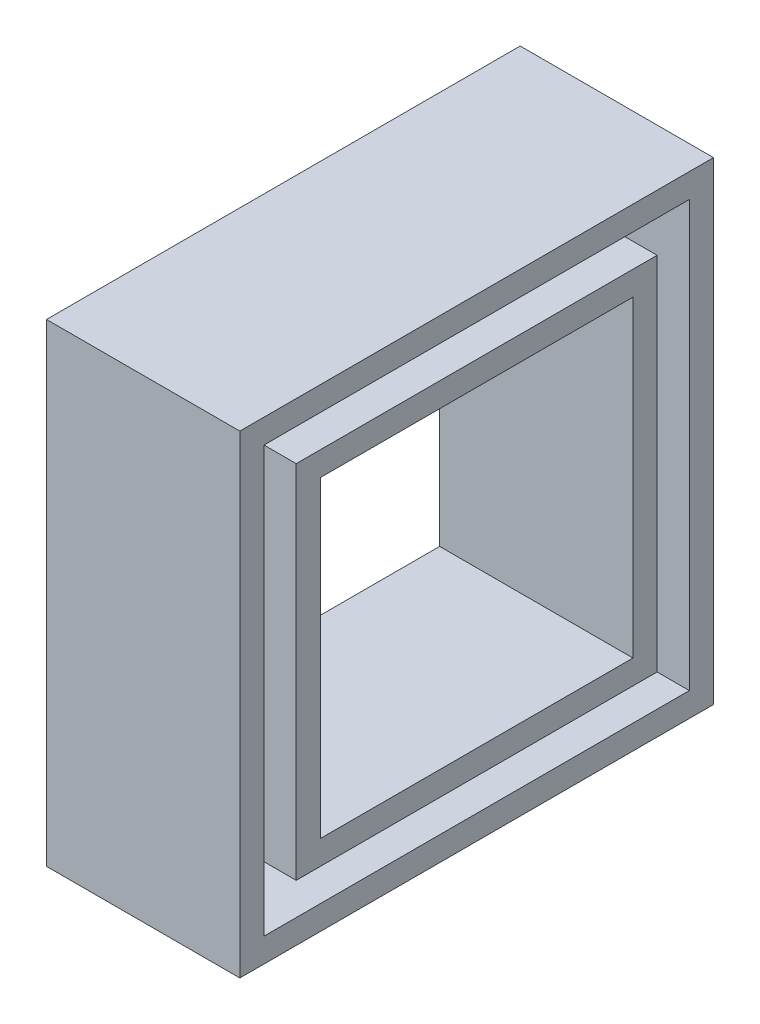
ISO-10303-21;
HEADER;
FILE_DESCRIPTION(('STEP AP214'),'2;1');
FILE_NAME('part.step','',(''),(''),'','','');
FILE_SCHEMA(('AUTOMOTIVE_DESIGN { 1 0 10303 214 1 1 1 1 }'));
ENDSEC;
DATA;
#1=APPLICATION_CONTEXT('core data for automotive mechanical design processes');
#2=APPLICATION_PROTOCOL_DEFINITION('international standard','automotive_design',2000,#1);
#3=PRODUCT_CONTEXT('',#1,'mechanical');
#4=PRODUCT('Part','Part','',(#3));
#5=PRODUCT_RELATED_PRODUCT_CATEGORY('part','',(#4));
#6=PRODUCT_DEFINITION_FORMATION('','',#4);
#7=PRODUCT_DEFINITION_CONTEXT('part definition',#1,'design');
#8=PRODUCT_DEFINITION('design','',#6,#7);
#9=PRODUCT_DEFINITION_SHAPE('','',#8);
#10=(LENGTH_UNIT() NAMED_UNIT(*) SI_UNIT(.MILLI.,.METRE.));
#11=(NAMED_UNIT(*) PLANE_ANGLE_UNIT() SI_UNIT($,.RADIAN.));
#12=(NAMED_UNIT(*) SI_UNIT($,.STERADIAN.) SOLID_ANGLE_UNIT());
#13=UNCERTAINTY_MEASURE_WITH_UNIT(LENGTH_MEASURE(1.E-05),#10,'distance_accuracy_value','');
#14=(GEOMETRIC_REPRESENTATION_CONTEXT(3) GLOBAL_UNCERTAINTY_ASSIGNED_CONTEXT((#13)) GLOBAL_UNIT_ASSIGNED_CONTEXT((#10,
#11,#12)) REPRESENTATION_CONTEXT('',''));
#15=CARTESIAN_POINT('',(0.,0.,0.));
#16=DIRECTION('',(0.,0.,1.));
#17=DIRECTION('',(1.,0.,0.));
#18=AXIS2_PLACEMENT_3D('',#15,#16,#17);
#19=CARTESIAN_POINT('',(10.,0.,0.));
#20=DIRECTION('',(1.,0.,0.));
#21=DIRECTION('',(0.,0.,-1.));
#22=AXIS2_PLACEMENT_3D('',#19,#20,#21);
#23=PLANE('',#22);
#24=DIRECTION('',(0.,0.,1.));
#25=VECTOR('',#24,1.);
#26=CARTESIAN_POINT('',(10.,-3.,0.));
#27=LINE('',#26,#25);
#28=CARTESIAN_POINT('',(10.,-3.,3.));
#29=VERTEX_POINT('',#28);
#30=CARTESIAN_POINT('',(10.,-3.,22.4));
#31=VERTEX_POINT('',#30);
#32=EDGE_CURVE('E309',#29,#31,#27,.T.);
#33=ORIENTED_EDGE('',*,*,#32,.F.);
#34=DIRECTION('',(0.,-1.,0.));
#35=VECTOR('',#34,1.);
#36=CARTESIAN_POINT('',(10.,0.,3.));
#37=LINE('',#36,#35);
#38=CARTESIAN_POINT('',(10.,-22.4,3.));
#39=VERTEX_POINT('',#38);
#40=EDGE_CURVE('E313',#29,#39,#37,.T.);
#41=ORIENTED_EDGE('',*,*,#40,.T.);
#42=DIRECTION('',(0.,0.,1.));
#43=VECTOR('',#42,1.);
#44=CARTESIAN_POINT('',(10.,-22.4,0.));
#45=LINE('',#44,#43);
#46=CARTESIAN_POINT('',(10.,-22.4,22.4));
#47=VERTEX_POINT('',#46);
#48=EDGE_CURVE('E317',#39,#47,#45,.T.);
#49=ORIENTED_EDGE('',*,*,#48,.T.);
#50=DIRECTION('',(0.,-1.,0.));
#51=VECTOR('',#50,1.);
#52=CARTESIAN_POINT('',(10.,0.,22.4));
#53=LINE('',#52,#51);
#54=EDGE_CURVE('E320',#31,#47,#53,.T.);
#55=ORIENTED_EDGE('',*,*,#54,.F.);
#56=EDGE_LOOP('',(#33,#41,#49,#55));
#57=FACE_BOUND('',#56,.T.);
#58=DIRECTION('',(0.,1.,0.));
#59=VECTOR('',#58,1.);
#60=CARTESIAN_POINT('',(10.,-1.5,1.5));
#61=LINE('',#60,#59);
#62=CARTESIAN_POINT('',(10.,-23.9,1.5));
#63=VERTEX_POINT('',#62);
#64=CARTESIAN_POINT('',(10.,-1.5,1.5));
#65=VERTEX_POINT('',#64);
#66=EDGE_CURVE('E245',#63,#65,#61,.T.);
#67=ORIENTED_EDGE('',*,*,#66,.T.);
#68=DIRECTION('',(0.,0.,1.));
#69=VECTOR('',#68,1.);
#70=CARTESIAN_POINT('',(10.,-1.5,23.9));
#71=LINE('',#70,#69);
#72=CARTESIAN_POINT('',(10.,-1.5,23.9));
#73=VERTEX_POINT('',#72);
#74=EDGE_CURVE('E210',#65,#73,#71,.T.);
#75=ORIENTED_EDGE('',*,*,#74,.T.);
#76=DIRECTION('',(0.,-1.,0.));
#77=VECTOR('',#76,1.);
#78=CARTESIAN_POINT('',(10.,-1.5,23.9));
#79=LINE('',#78,#77);
#80=CARTESIAN_POINT('',(10.,-23.9,23.9));
#81=VERTEX_POINT('',#80);
#82=EDGE_CURVE('E252',#73,#81,#79,.T.);
#83=ORIENTED_EDGE('',*,*,#82,.T.);
#84=DIRECTION('',(0.,0.,-1.));
#85=VECTOR('',#84,1.);
#86=CARTESIAN_POINT('',(10.,-23.9,23.9));
#87=LINE('',#86,#85);
#88=EDGE_CURVE('E80',#81,#63,#87,.T.);
#89=ORIENTED_EDGE('',*,*,#88,.T.);
#90=EDGE_LOOP('',(#67,#75,#83,#89));
#91=FACE_BOUND('',#90,.T.);
#92=ADVANCED_FACE('F64',(#57,#91),#23,.T.);
#93=CARTESIAN_POINT('',(10.,-3.,0.));
#94=DIRECTION('',(0.,-1.,0.));
#95=DIRECTION('',(0.,0.,-1.));
#96=AXIS2_PLACEMENT_3D('',#93,#94,#95);
#97=PLANE('',#96);
#98=DIRECTION('',(-1.,0.,0.));
#99=VECTOR('',#98,1.);
#100=CARTESIAN_POINT('',(10.,-3.,22.4));
#101=LINE('',#100,#99);
#102=CARTESIAN_POINT('',(-2.,-3.,22.4));
#103=VERTEX_POINT('',#102);
#104=EDGE_CURVE('E324',#31,#103,#101,.T.);
#105=ORIENTED_EDGE('',*,*,#104,.T.);
#106=DIRECTION('',(0.,0.,-1.));
#107=VECTOR('',#106,1.);
#108=CARTESIAN_POINT('',(-2.,-3.,3.));
#109=LINE('',#108,#107);
#110=CARTESIAN_POINT('',(-2.,-3.,3.));
#111=VERTEX_POINT('',#110);
#112=EDGE_CURVE('E280',#103,#111,#109,.T.);
#113=ORIENTED_EDGE('',*,*,#112,.T.);
#114=DIRECTION('',(-1.,0.,0.));
#115=VECTOR('',#114,1.);
#116=CARTESIAN_POINT('',(10.,-3.,3.));
#117=LINE('',#116,#115);
#118=EDGE_CURVE('E12',#29,#111,#117,.T.);
#119=ORIENTED_EDGE('',*,*,#118,.F.);
#120=ORIENTED_EDGE('',*,*,#32,.T.);
#121=EDGE_LOOP('',(#105,#113,#119,#120));
#122=FACE_BOUND('',#121,.T.);
#123=ADVANCED_FACE('F66',(#122),#97,.T.);
#124=CARTESIAN_POINT('',(10.,0.,3.));
#125=DIRECTION('',(0.,0.,-1.));
#126=DIRECTION('',(0.,1.,0.));
#127=AXIS2_PLACEMENT_3D('',#124,#125,#126);
#128=PLANE('',#127);
#129=ORIENTED_EDGE('',*,*,#118,.T.);
#130=DIRECTION('',(0.,-1.,0.));
#131=VECTOR('',#130,1.);
#132=CARTESIAN_POINT('',(-2.,-3.,3.));
#133=LINE('',#132,#131);
#134=CARTESIAN_POINT('',(-2.,-22.4,3.));
#135=VERTEX_POINT('',#134);
#136=EDGE_CURVE('E268',#111,#135,#133,.T.);
#137=ORIENTED_EDGE('',*,*,#136,.T.);
#138=DIRECTION('',(-1.,0.,0.));
#139=VECTOR('',#138,1.);
#140=CARTESIAN_POINT('',(10.,-22.4,3.));
#141=LINE('',#140,#139);
#142=EDGE_CURVE('E73',#39,#135,#141,.T.);
#143=ORIENTED_EDGE('',*,*,#142,.F.);
#144=ORIENTED_EDGE('',*,*,#40,.F.);
#145=EDGE_LOOP('',(#129,#137,#143,#144));
#146=FACE_BOUND('',#145,.T.);
#147=ADVANCED_FACE('F339',(#146),#128,.F.);
#148=CARTESIAN_POINT('',(10.,-22.4,0.));
#149=DIRECTION('',(0.,-1.,0.));
#150=DIRECTION('',(0.,0.,-1.));
#151=AXIS2_PLACEMENT_3D('',#148,#149,#150);
#152=PLANE('',#151);
#153=ORIENTED_EDGE('',*,*,#142,.T.);
#154=DIRECTION('',(0.,0.,1.));
#155=VECTOR('',#154,1.);
#156=CARTESIAN_POINT('',(-2.,-22.4,3.));
#157=LINE('',#156,#155);
#158=CARTESIAN_POINT('',(-2.,-22.4,22.4));
#159=VERTEX_POINT('',#158);
#160=EDGE_CURVE('E272',#135,#159,#157,.T.);
#161=ORIENTED_EDGE('',*,*,#160,.T.);
#162=DIRECTION('',(-1.,0.,0.));
#163=VECTOR('',#162,1.);
#164=CARTESIAN_POINT('',(10.,-22.4,22.4));
#165=LINE('',#164,#163);
#166=EDGE_CURVE('E327',#47,#159,#165,.T.);
#167=ORIENTED_EDGE('',*,*,#166,.F.);
#168=ORIENTED_EDGE('',*,*,#48,.F.);
#169=EDGE_LOOP('',(#153,#161,#167,#168));
#170=FACE_BOUND('',#169,.T.);
#171=ADVANCED_FACE('F332',(#170),#152,.F.);
#172=CARTESIAN_POINT('',(10.,0.,22.4));
#173=DIRECTION('',(0.,0.,-1.));
#174=DIRECTION('',(0.,1.,0.));
#175=AXIS2_PLACEMENT_3D('',#172,#173,#174);
#176=PLANE('',#175);
#177=ORIENTED_EDGE('',*,*,#166,.T.);
#178=DIRECTION('',(0.,1.,0.));
#179=VECTOR('',#178,1.);
#180=CARTESIAN_POINT('',(-2.,-3.,22.4));
#181=LINE('',#180,#179);
#182=EDGE_CURVE('E276',#159,#103,#181,.T.);
#183=ORIENTED_EDGE('',*,*,#182,.T.);
#184=ORIENTED_EDGE('',*,*,#104,.F.);
#185=ORIENTED_EDGE('',*,*,#54,.T.);
#186=EDGE_LOOP('',(#177,#183,#184,#185));
#187=FACE_BOUND('',#186,.T.);
#188=ADVANCED_FACE('F344',(#187),#176,.T.);
#189=CARTESIAN_POINT('',(-2.,0.,0.));
#190=DIRECTION('',(-1.,0.,0.));
#191=DIRECTION('',(0.,0.,1.));
#192=AXIS2_PLACEMENT_3D('',#189,#190,#191);
#193=PLANE('',#192);
#194=DIRECTION('',(0.,-1.,0.));
#195=VECTOR('',#194,1.);
#196=CARTESIAN_POINT('',(-2.,2.,-2.));
#197=LINE('',#196,#195);
#198=CARTESIAN_POINT('',(-2.,2.,-2.));
#199=VERTEX_POINT('',#198);
#200=CARTESIAN_POINT('',(-2.,-27.4,-2.));
#201=VERTEX_POINT('',#200);
#202=EDGE_CURVE('E284',#199,#201,#197,.T.);
#203=ORIENTED_EDGE('',*,*,#202,.T.);
#204=DIRECTION('',(0.,0.,1.));
#205=VECTOR('',#204,1.);
#206=CARTESIAN_POINT('',(-2.,-27.4,-2.));
#207=LINE('',#206,#205);
#208=CARTESIAN_POINT('',(-2.,-27.4,27.4));
#209=VERTEX_POINT('',#208);
#210=EDGE_CURVE('E288',#201,#209,#207,.T.);
#211=ORIENTED_EDGE('',*,*,#210,.T.);
#212=DIRECTION('',(0.,1.,0.));
#213=VECTOR('',#212,1.);
#214=CARTESIAN_POINT('',(-2.,2.,27.4));
#215=LINE('',#214,#213);
#216=CARTESIAN_POINT('',(-2.,2.,27.4));
#217=VERTEX_POINT('',#216);
#218=EDGE_CURVE('E291',#209,#217,#215,.T.);
#219=ORIENTED_EDGE('',*,*,#218,.T.);
#220=DIRECTION('',(0.,0.,-1.));
#221=VECTOR('',#220,1.);
#222=CARTESIAN_POINT('',(-2.,2.,-2.));
#223=LINE('',#222,#221);
#224=EDGE_CURVE('E294',#217,#199,#223,.T.);
#225=ORIENTED_EDGE('',*,*,#224,.T.);
#226=EDGE_LOOP('',(#203,#211,#219,#225));
#227=FACE_BOUND('',#226,.T.);
#228=ORIENTED_EDGE('',*,*,#160,.F.);
#229=ORIENTED_EDGE('',*,*,#136,.F.);
#230=ORIENTED_EDGE('',*,*,#112,.F.);
#231=ORIENTED_EDGE('',*,*,#182,.F.);
#232=EDGE_LOOP('',(#228,#229,#230,#231));
#233=FACE_BOUND('',#232,.T.);
#234=ADVANCED_FACE('F342',(#227,#233),#193,.T.);
#235=CARTESIAN_POINT('',(-2.,2.,-2.));
#236=DIRECTION('',(0.,0.,1.));
#237=DIRECTION('',(1.,0.,0.));
#238=AXIS2_PLACEMENT_3D('',#235,#236,#237);
#239=PLANE('',#238);
#240=DIRECTION('',(1.,0.,0.));
#241=VECTOR('',#240,1.);
#242=CARTESIAN_POINT('',(-2.,2.,-2.));
#243=LINE('',#242,#241);
#244=CARTESIAN_POINT('',(10.,2.,-2.));
#245=VERTEX_POINT('',#244);
#246=EDGE_CURVE('E297',#199,#245,#243,.T.);
#247=ORIENTED_EDGE('',*,*,#246,.T.);
#248=DIRECTION('',(0.,-1.,0.));
#249=VECTOR('',#248,1.);
#250=CARTESIAN_POINT('',(10.,0.,-2.));
#251=LINE('',#250,#249);
#252=CARTESIAN_POINT('',(10.,-27.4,-2.));
#253=VERTEX_POINT('',#252);
#254=EDGE_CURVE('E226',#245,#253,#251,.T.);
#255=ORIENTED_EDGE('',*,*,#254,.T.);
#256=DIRECTION('',(1.,0.,0.));
#257=VECTOR('',#256,1.);
#258=CARTESIAN_POINT('',(-2.,-27.4,-2.));
#259=LINE('',#258,#257);
#260=EDGE_CURVE('E306',#201,#253,#259,.T.);
#261=ORIENTED_EDGE('',*,*,#260,.F.);
#262=ORIENTED_EDGE('',*,*,#202,.F.);
#263=EDGE_LOOP('',(#247,#255,#261,#262));
#264=FACE_BOUND('',#263,.T.);
#265=ADVANCED_FACE('F362',(#264),#239,.F.);
#266=CARTESIAN_POINT('',(-2.,-27.4,-2.));
#267=DIRECTION('',(0.,1.,0.));
#268=DIRECTION('',(0.,0.,1.));
#269=AXIS2_PLACEMENT_3D('',#266,#267,#268);
#270=PLANE('',#269);
#271=ORIENTED_EDGE('',*,*,#260,.T.);
#272=DIRECTION('',(0.,0.,1.));
#273=VECTOR('',#272,1.);
#274=CARTESIAN_POINT('',(10.,-27.4,0.));
#275=LINE('',#274,#273);
#276=CARTESIAN_POINT('',(10.,-27.4,27.4));
#277=VERTEX_POINT('',#276);
#278=EDGE_CURVE('E264',#253,#277,#275,.T.);
#279=ORIENTED_EDGE('',*,*,#278,.T.);
#280=DIRECTION('',(1.,0.,0.));
#281=VECTOR('',#280,1.);
#282=CARTESIAN_POINT('',(-2.,-27.4,27.4));
#283=LINE('',#282,#281);
#284=EDGE_CURVE('E303',#209,#277,#283,.T.);
#285=ORIENTED_EDGE('',*,*,#284,.F.);
#286=ORIENTED_EDGE('',*,*,#210,.F.);
#287=EDGE_LOOP('',(#271,#279,#285,#286));
#288=FACE_BOUND('',#287,.T.);
#289=ADVANCED_FACE('F388',(#288),#270,.F.);
#290=CARTESIAN_POINT('',(-2.,2.,27.4));
#291=DIRECTION('',(0.,0.,-1.));
#292=DIRECTION('',(-1.,0.,0.));
#293=AXIS2_PLACEMENT_3D('',#290,#291,#292);
#294=PLANE('',#293);
#295=ORIENTED_EDGE('',*,*,#284,.T.);
#296=DIRECTION('',(0.,-1.,0.));
#297=VECTOR('',#296,1.);
#298=CARTESIAN_POINT('',(10.,0.,27.4));
#299=LINE('',#298,#297);
#300=CARTESIAN_POINT('',(10.,2.,27.4));
#301=VERTEX_POINT('',#300);
#302=EDGE_CURVE('E260',#301,#277,#299,.T.);
#303=ORIENTED_EDGE('',*,*,#302,.F.);
#304=DIRECTION('',(1.,0.,0.));
#305=VECTOR('',#304,1.);
#306=CARTESIAN_POINT('',(-2.,2.,27.4));
#307=LINE('',#306,#305);
#308=EDGE_CURVE('E300',#217,#301,#307,.T.);
#309=ORIENTED_EDGE('',*,*,#308,.F.);
#310=ORIENTED_EDGE('',*,*,#218,.F.);
#311=EDGE_LOOP('',(#295,#303,#309,#310));
#312=FACE_BOUND('',#311,.T.);
#313=ADVANCED_FACE('F395',(#312),#294,.F.);
#314=CARTESIAN_POINT('',(-2.,2.,-2.));
#315=DIRECTION('',(0.,-1.,0.));
#316=DIRECTION('',(0.,0.,-1.));
#317=AXIS2_PLACEMENT_3D('',#314,#315,#316);
#318=PLANE('',#317);
#319=ORIENTED_EDGE('',*,*,#308,.T.);
#320=DIRECTION('',(0.,0.,1.));
#321=VECTOR('',#320,1.);
#322=CARTESIAN_POINT('',(10.,2.,0.));
#323=LINE('',#322,#321);
#324=EDGE_CURVE('E256',#245,#301,#323,.T.);
#325=ORIENTED_EDGE('',*,*,#324,.F.);
#326=ORIENTED_EDGE('',*,*,#246,.F.);
#327=ORIENTED_EDGE('',*,*,#224,.F.);
#328=EDGE_LOOP('',(#319,#325,#326,#327));
#329=FACE_BOUND('',#328,.T.);
#330=ADVANCED_FACE('F402',(#329),#318,.F.);
#331=CARTESIAN_POINT('',(10.,0.,0.));
#332=DIRECTION('',(1.,0.,0.));
#333=DIRECTION('',(0.,0.,-1.));
#334=AXIS2_PLACEMENT_3D('',#331,#332,#333);
#335=PLANE('',#334);
#336=DIRECTION('',(0.,0.,1.));
#337=VECTOR('',#336,1.);
#338=CARTESIAN_POINT('',(10.,0.499999999999997,25.9));
#339=LINE('',#338,#337);
#340=CARTESIAN_POINT('',(10.,0.499999999999997,-0.5));
#341=VERTEX_POINT('',#340);
#342=CARTESIAN_POINT('',(10.,0.499999999999997,25.9));
#343=VERTEX_POINT('',#342);
#344=EDGE_CURVE('E88',#341,#343,#339,.T.);
#345=ORIENTED_EDGE('',*,*,#344,.F.);
#346=DIRECTION('',(0.,1.,0.));
#347=VECTOR('',#346,1.);
#348=CARTESIAN_POINT('',(10.,0.499999999999997,-0.5));
#349=LINE('',#348,#347);
#350=CARTESIAN_POINT('',(10.,-25.9,-0.5));
#351=VERTEX_POINT('',#350);
#352=EDGE_CURVE('E221',#351,#341,#349,.T.);
#353=ORIENTED_EDGE('',*,*,#352,.F.);
#354=DIRECTION('',(0.,0.,-1.));
#355=VECTOR('',#354,1.);
#356=CARTESIAN_POINT('',(10.,-25.9,25.9));
#357=LINE('',#356,#355);
#358=CARTESIAN_POINT('',(10.,-25.9,25.9));
#359=VERTEX_POINT('',#358);
#360=EDGE_CURVE('E574',#359,#351,#357,.T.);
#361=ORIENTED_EDGE('',*,*,#360,.F.);
#362=DIRECTION('',(0.,-1.,0.));
#363=VECTOR('',#362,1.);
#364=CARTESIAN_POINT('',(10.,0.499999999999997,25.9));
#365=LINE('',#364,#363);
#366=EDGE_CURVE('E196',#343,#359,#365,.T.);
#367=ORIENTED_EDGE('',*,*,#366,.F.);
#368=EDGE_LOOP('',(#345,#353,#361,#367));
#369=FACE_BOUND('',#368,.T.);
#370=ORIENTED_EDGE('',*,*,#254,.F.);
#371=ORIENTED_EDGE('',*,*,#324,.T.);
#372=ORIENTED_EDGE('',*,*,#302,.T.);
#373=ORIENTED_EDGE('',*,*,#278,.F.);
#374=EDGE_LOOP('',(#370,#371,#372,#373));
#375=FACE_BOUND('',#374,.T.);
#376=ADVANCED_FACE('F409',(#369,#375),#335,.T.);
#377=CARTESIAN_POINT('',(-37.3352380466497,0.499999999999997,25.9));
#378=DIRECTION('',(0.,0.,1.));
#379=DIRECTION('',(1.,0.,0.));
#380=AXIS2_PLACEMENT_3D('',#377,#378,#379);
#381=PLANE('',#380);
#382=DIRECTION('',(1.,0.,0.));
#383=VECTOR('',#382,1.);
#384=CARTESIAN_POINT('',(-37.3352380466497,0.499999999999997,25.9));
#385=LINE('',#384,#383);
#386=CARTESIAN_POINT('',(0.,0.499999999999997,25.9));
#387=VERTEX_POINT('',#386);
#388=EDGE_CURVE('E229',#387,#343,#385,.T.);
#389=ORIENTED_EDGE('',*,*,#388,.T.);
#390=ORIENTED_EDGE('',*,*,#366,.T.);
#391=DIRECTION('',(1.,0.,0.));
#392=VECTOR('',#391,1.);
#393=CARTESIAN_POINT('',(-37.3352380466497,-25.9,25.9));
#394=LINE('',#393,#392);
#395=CARTESIAN_POINT('',(0.,-25.9,25.9));
#396=VERTEX_POINT('',#395);
#397=EDGE_CURVE('E182',#396,#359,#394,.T.);
#398=ORIENTED_EDGE('',*,*,#397,.F.);
#399=DIRECTION('',(0.,-1.,0.));
#400=VECTOR('',#399,1.);
#401=CARTESIAN_POINT('',(0.,0.499999999999997,25.9));
#402=LINE('',#401,#400);
#403=EDGE_CURVE('E193',#387,#396,#402,.T.);
#404=ORIENTED_EDGE('',*,*,#403,.F.);
#405=EDGE_LOOP('',(#389,#390,#398,#404));
#406=FACE_BOUND('',#405,.T.);
#407=ADVANCED_FACE('F192',(#406),#381,.F.);
#408=CARTESIAN_POINT('',(-37.3352380466497,-25.9,25.9));
#409=DIRECTION('',(0.,-1.,0.));
#410=DIRECTION('',(0.,0.,-1.));
#411=AXIS2_PLACEMENT_3D('',#408,#409,#410);
#412=PLANE('',#411);
#413=ORIENTED_EDGE('',*,*,#397,.T.);
#414=ORIENTED_EDGE('',*,*,#360,.T.);
#415=DIRECTION('',(1.,0.,0.));
#416=VECTOR('',#415,1.);
#417=CARTESIAN_POINT('',(-37.3352380466497,-25.9,-0.5));
#418=LINE('',#417,#416);
#419=CARTESIAN_POINT('',(0.,-25.9,-0.499999999999997));
#420=VERTEX_POINT('',#419);
#421=EDGE_CURVE('E184',#420,#351,#418,.T.);
#422=ORIENTED_EDGE('',*,*,#421,.F.);
#423=DIRECTION('',(0.,0.,-1.));
#424=VECTOR('',#423,1.);
#425=CARTESIAN_POINT('',(0.,-25.9,25.9));
#426=LINE('',#425,#424);
#427=EDGE_CURVE('E178',#396,#420,#426,.T.);
#428=ORIENTED_EDGE('',*,*,#427,.F.);
#429=EDGE_LOOP('',(#413,#414,#422,#428));
#430=FACE_BOUND('',#429,.T.);
#431=ADVANCED_FACE('F180',(#430),#412,.F.);
#432=CARTESIAN_POINT('',(-37.3352380466497,0.499999999999997,-0.5));
#433=DIRECTION('',(0.,0.,-1.));
#434=DIRECTION('',(0.,1.,0.));
#435=AXIS2_PLACEMENT_3D('',#432,#433,#434);
#436=PLANE('',#435);
#437=ORIENTED_EDGE('',*,*,#421,.T.);
#438=ORIENTED_EDGE('',*,*,#352,.T.);
#439=DIRECTION('',(1.,0.,0.));
#440=VECTOR('',#439,1.);
#441=CARTESIAN_POINT('',(-37.3352380466497,0.499999999999997,-0.5));
#442=LINE('',#441,#440);
#443=CARTESIAN_POINT('',(0.,0.499999999999997,-0.5));
#444=VERTEX_POINT('',#443);
#445=EDGE_CURVE('E189',#444,#341,#442,.T.);
#446=ORIENTED_EDGE('',*,*,#445,.F.);
#447=DIRECTION('',(0.,1.,0.));
#448=VECTOR('',#447,1.);
#449=CARTESIAN_POINT('',(0.,0.499999999999997,-0.5));
#450=LINE('',#449,#448);
#451=EDGE_CURVE('E230',#420,#444,#450,.T.);
#452=ORIENTED_EDGE('',*,*,#451,.F.);
#453=EDGE_LOOP('',(#437,#438,#446,#452));
#454=FACE_BOUND('',#453,.T.);
#455=ADVANCED_FACE('F437',(#454),#436,.F.);
#456=CARTESIAN_POINT('',(-37.3352380466497,0.499999999999997,25.9));
#457=DIRECTION('',(0.,1.,0.));
#458=DIRECTION('',(0.,0.,1.));
#459=AXIS2_PLACEMENT_3D('',#456,#457,#458);
#460=PLANE('',#459);
#461=ORIENTED_EDGE('',*,*,#445,.T.);
#462=ORIENTED_EDGE('',*,*,#344,.T.);
#463=ORIENTED_EDGE('',*,*,#388,.F.);
#464=DIRECTION('',(0.,0.,1.));
#465=VECTOR('',#464,1.);
#466=CARTESIAN_POINT('',(0.,0.499999999999997,25.9));
#467=LINE('',#466,#465);
#468=EDGE_CURVE('E203',#444,#387,#467,.T.);
#469=ORIENTED_EDGE('',*,*,#468,.F.);
#470=EDGE_LOOP('',(#461,#462,#463,#469));
#471=FACE_BOUND('',#470,.T.);
#472=ADVANCED_FACE('F444',(#471),#460,.F.);
#473=CARTESIAN_POINT('',(0.,0.,0.));
#474=DIRECTION('',(-1.,0.,0.));
#475=DIRECTION('',(0.,0.,1.));
#476=AXIS2_PLACEMENT_3D('',#473,#474,#475);
#477=PLANE('',#476);
#478=ORIENTED_EDGE('',*,*,#468,.T.);
#479=ORIENTED_EDGE('',*,*,#403,.T.);
#480=ORIENTED_EDGE('',*,*,#427,.T.);
#481=ORIENTED_EDGE('',*,*,#451,.T.);
#482=EDGE_LOOP('',(#478,#479,#480,#481));
#483=FACE_BOUND('',#482,.T.);
#484=DIRECTION('',(0.,1.,0.));
#485=VECTOR('',#484,1.);
#486=CARTESIAN_POINT('',(0.,-1.5,1.5));
#487=LINE('',#486,#485);
#488=CARTESIAN_POINT('',(0.,-23.9,1.5));
#489=VERTEX_POINT('',#488);
#490=CARTESIAN_POINT('',(0.,-1.5,1.5));
#491=VERTEX_POINT('',#490);
#492=EDGE_CURVE('E217',#489,#491,#487,.T.);
#493=ORIENTED_EDGE('',*,*,#492,.F.);
#494=DIRECTION('',(0.,0.,-1.));
#495=VECTOR('',#494,1.);
#496=CARTESIAN_POINT('',(0.,-23.9,23.9));
#497=LINE('',#496,#495);
#498=CARTESIAN_POINT('',(0.,-23.9,23.9));
#499=VERTEX_POINT('',#498);
#500=EDGE_CURVE('E222',#499,#489,#497,.T.);
#501=ORIENTED_EDGE('',*,*,#500,.F.);
#502=DIRECTION('',(0.,-1.,0.));
#503=VECTOR('',#502,1.);
#504=CARTESIAN_POINT('',(0.,-1.5,23.9));
#505=LINE('',#504,#503);
#506=CARTESIAN_POINT('',(0.,-1.5,23.9));
#507=VERTEX_POINT('',#506);
#508=EDGE_CURVE('E216',#507,#499,#505,.T.);
#509=ORIENTED_EDGE('',*,*,#508,.F.);
#510=DIRECTION('',(0.,0.,1.));
#511=VECTOR('',#510,1.);
#512=CARTESIAN_POINT('',(0.,-1.5,23.9));
#513=LINE('',#512,#511);
#514=EDGE_CURVE('E212',#491,#507,#513,.T.);
#515=ORIENTED_EDGE('',*,*,#514,.F.);
#516=EDGE_LOOP('',(#493,#501,#509,#515));
#517=FACE_BOUND('',#516,.T.);
#518=ADVANCED_FACE('F201',(#483,#517),#477,.F.);
#519=CARTESIAN_POINT('',(-37.3352380466497,-1.5,23.9));
#520=DIRECTION('',(0.,1.,0.));
#521=DIRECTION('',(0.,0.,1.));
#522=AXIS2_PLACEMENT_3D('',#519,#520,#521);
#523=PLANE('',#522);
#524=ORIENTED_EDGE('',*,*,#514,.T.);
#525=DIRECTION('',(1.,0.,0.));
#526=VECTOR('',#525,1.);
#527=CARTESIAN_POINT('',(-37.3352380466497,-1.5,23.9));
#528=LINE('',#527,#526);
#529=EDGE_CURVE('E249',#507,#73,#528,.T.);
#530=ORIENTED_EDGE('',*,*,#529,.T.);
#531=ORIENTED_EDGE('',*,*,#74,.F.);
#532=DIRECTION('',(1.,0.,0.));
#533=VECTOR('',#532,1.);
#534=CARTESIAN_POINT('',(-37.3352380466497,-1.5,1.5));
#535=LINE('',#534,#533);
#536=EDGE_CURVE('E199',#491,#65,#535,.T.);
#537=ORIENTED_EDGE('',*,*,#536,.F.);
#538=EDGE_LOOP('',(#524,#530,#531,#537));
#539=FACE_BOUND('',#538,.T.);
#540=ADVANCED_FACE('F458',(#539),#523,.T.);
#541=CARTESIAN_POINT('',(-37.3352380466497,-1.5,1.5));
#542=DIRECTION('',(0.,0.,-1.));
#543=DIRECTION('',(0.,1.,0.));
#544=AXIS2_PLACEMENT_3D('',#541,#542,#543);
#545=PLANE('',#544);
#546=ORIENTED_EDGE('',*,*,#492,.T.);
#547=ORIENTED_EDGE('',*,*,#536,.T.);
#548=ORIENTED_EDGE('',*,*,#66,.F.);
#549=DIRECTION('',(1.,0.,0.));
#550=VECTOR('',#549,1.);
#551=CARTESIAN_POINT('',(-37.3352380466497,-23.9,1.5));
#552=LINE('',#551,#550);
#553=EDGE_CURVE('E242',#489,#63,#552,.T.);
#554=ORIENTED_EDGE('',*,*,#553,.F.);
#555=EDGE_LOOP('',(#546,#547,#548,#554));
#556=FACE_BOUND('',#555,.T.);
#557=ADVANCED_FACE('F465',(#556),#545,.T.);
#558=CARTESIAN_POINT('',(-37.3352380466497,-23.9,23.9));
#559=DIRECTION('',(0.,-1.,0.));
#560=DIRECTION('',(0.,0.,-1.));
#561=AXIS2_PLACEMENT_3D('',#558,#559,#560);
#562=PLANE('',#561);
#563=ORIENTED_EDGE('',*,*,#500,.T.);
#564=ORIENTED_EDGE('',*,*,#553,.T.);
#565=ORIENTED_EDGE('',*,*,#88,.F.);
#566=DIRECTION('',(1.,0.,0.));
#567=VECTOR('',#566,1.);
#568=CARTESIAN_POINT('',(-37.3352380466497,-23.9,23.9));
#569=LINE('',#568,#567);
#570=EDGE_CURVE('E246',#499,#81,#569,.T.);
#571=ORIENTED_EDGE('',*,*,#570,.F.);
#572=EDGE_LOOP('',(#563,#564,#565,#571));
#573=FACE_BOUND('',#572,.T.);
#574=ADVANCED_FACE('F473',(#573),#562,.T.);
#575=CARTESIAN_POINT('',(-37.3352380466497,-1.5,23.9));
#576=DIRECTION('',(0.,0.,1.));
#577=DIRECTION('',(1.,0.,0.));
#578=AXIS2_PLACEMENT_3D('',#575,#576,#577);
#579=PLANE('',#578);
#580=ORIENTED_EDGE('',*,*,#508,.T.);
#581=ORIENTED_EDGE('',*,*,#570,.T.);
#582=ORIENTED_EDGE('',*,*,#82,.F.);
#583=ORIENTED_EDGE('',*,*,#529,.F.);
#584=EDGE_LOOP('',(#580,#581,#582,#583));
#585=FACE_BOUND('',#584,.T.);
#586=ADVANCED_FACE('F481',(#585),#579,.T.);
#587=CLOSED_SHELL('',(#92,#123,#147,#171,#188,#234,#265,#289,#313,#330,#376,#407,#431,#455,#472,
#518,#540,#557,#574,#586));
#588=MANIFOLD_SOLID_BREP('B2',#587);
#589=ADVANCED_BREP_SHAPE_REPRESENTATION('',(#18,#588),#14);
#590=SHAPE_DEFINITION_REPRESENTATION(#9,#589);
ENDSEC;
END-ISO-10303-21;
